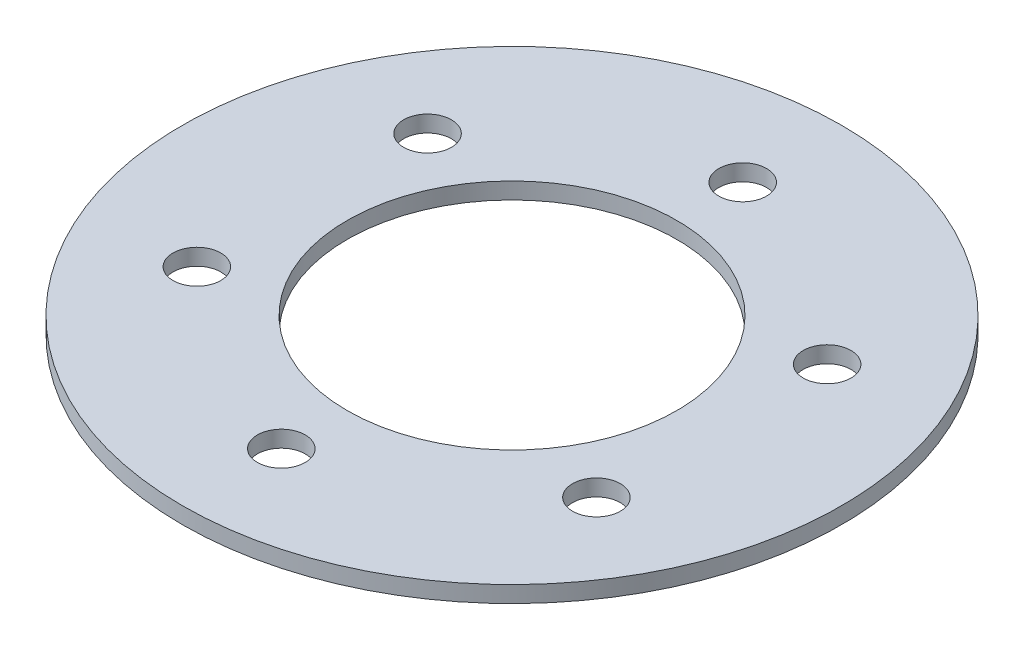
ISO-10303-21;
HEADER;
FILE_DESCRIPTION(('STEP AP214'),'2;1');
FILE_NAME('part.step','',(''),(''),'','','');
FILE_SCHEMA(('AUTOMOTIVE_DESIGN { 1 0 10303 214 1 1 1 1 }'));
ENDSEC;
DATA;
#1=APPLICATION_CONTEXT('core data for automotive mechanical design processes');
#2=APPLICATION_PROTOCOL_DEFINITION('international standard','automotive_design',2000,#1);
#3=PRODUCT_CONTEXT('',#1,'mechanical');
#4=PRODUCT('Part','Part','',(#3));
#5=PRODUCT_RELATED_PRODUCT_CATEGORY('part','',(#4));
#6=PRODUCT_DEFINITION_FORMATION('','',#4);
#7=PRODUCT_DEFINITION_CONTEXT('part definition',#1,'design');
#8=PRODUCT_DEFINITION('design','',#6,#7);
#9=PRODUCT_DEFINITION_SHAPE('','',#8);
#10=(LENGTH_UNIT() NAMED_UNIT(*) SI_UNIT(.MILLI.,.METRE.));
#11=(NAMED_UNIT(*) PLANE_ANGLE_UNIT() SI_UNIT($,.RADIAN.));
#12=(NAMED_UNIT(*) SI_UNIT($,.STERADIAN.) SOLID_ANGLE_UNIT());
#13=UNCERTAINTY_MEASURE_WITH_UNIT(LENGTH_MEASURE(1.E-05),#10,'distance_accuracy_value','');
#14=(GEOMETRIC_REPRESENTATION_CONTEXT(3) GLOBAL_UNCERTAINTY_ASSIGNED_CONTEXT((#13)) GLOBAL_UNIT_ASSIGNED_CONTEXT((#10,
#11,#12)) REPRESENTATION_CONTEXT('',''));
#15=CARTESIAN_POINT('',(0.,0.,0.));
#16=DIRECTION('',(0.,0.,1.));
#17=DIRECTION('',(1.,0.,0.));
#18=AXIS2_PLACEMENT_3D('',#15,#16,#17);
#19=CARTESIAN_POINT('',(0.,1.,0.));
#20=DIRECTION('',(0.,1.,0.));
#21=DIRECTION('',(0.,0.,1.));
#22=AXIS2_PLACEMENT_3D('',#19,#20,#21);
#23=PLANE('',#22);
#24=CARTESIAN_POINT('',(12.1243556529821,1.,-7.));
#25=DIRECTION('',(0.,1.,0.));
#26=DIRECTION('',(0.,0.,1.));
#27=AXIS2_PLACEMENT_3D('',#24,#25,#26);
#28=CIRCLE('',#27,1.45);
#29=CARTESIAN_POINT('',(12.1243556529821,1.,-5.55));
#30=VERTEX_POINT('',#29);
#31=EDGE_CURVE('E90',#30,#30,#28,.T.);
#32=ORIENTED_EDGE('',*,*,#31,.F.);
#33=EDGE_LOOP('',(#32));
#34=FACE_BOUND('',#33,.T.);
#35=CARTESIAN_POINT('',(0.,1.,14.));
#36=DIRECTION('',(0.,1.,0.));
#37=DIRECTION('',(0.,0.,1.));
#38=AXIS2_PLACEMENT_3D('',#35,#36,#37);
#39=CIRCLE('',#38,1.45);
#40=CARTESIAN_POINT('',(0.,1.,15.45));
#41=VERTEX_POINT('',#40);
#42=EDGE_CURVE('E74',#41,#41,#39,.T.);
#43=ORIENTED_EDGE('',*,*,#42,.F.);
#44=EDGE_LOOP('',(#43));
#45=FACE_BOUND('',#44,.T.);
#46=CARTESIAN_POINT('',(0.,1.,-14.));
#47=DIRECTION('',(0.,1.,0.));
#48=DIRECTION('',(0.,0.,1.));
#49=AXIS2_PLACEMENT_3D('',#46,#47,#48);
#50=CIRCLE('',#49,1.45);
#51=CARTESIAN_POINT('',(0.,1.,-12.55));
#52=VERTEX_POINT('',#51);
#53=EDGE_CURVE('E58',#52,#52,#50,.T.);
#54=ORIENTED_EDGE('',*,*,#53,.F.);
#55=EDGE_LOOP('',(#54));
#56=FACE_BOUND('',#55,.T.);
#57=CARTESIAN_POINT('',(0.,1.,0.));
#58=DIRECTION('',(0.,1.,0.));
#59=DIRECTION('',(0.,0.,1.));
#60=AXIS2_PLACEMENT_3D('',#57,#58,#59);
#61=CIRCLE('',#60,20.);
#62=CARTESIAN_POINT('',(0.,1.,20.));
#63=VERTEX_POINT('',#62);
#64=EDGE_CURVE('E10',#63,#63,#61,.T.);
#65=ORIENTED_EDGE('',*,*,#64,.T.);
#66=EDGE_LOOP('',(#65));
#67=FACE_BOUND('',#66,.T.);
#68=CARTESIAN_POINT('',(-12.1243556529821,1.,-7.));
#69=DIRECTION('',(0.,1.,0.));
#70=DIRECTION('',(0.,0.,1.));
#71=AXIS2_PLACEMENT_3D('',#68,#69,#70);
#72=CIRCLE('',#71,1.45);
#73=CARTESIAN_POINT('',(-12.1243556529821,1.,-5.55));
#74=VERTEX_POINT('',#73);
#75=EDGE_CURVE('E52',#74,#74,#72,.T.);
#76=ORIENTED_EDGE('',*,*,#75,.F.);
#77=EDGE_LOOP('',(#76));
#78=FACE_BOUND('',#77,.T.);
#79=CARTESIAN_POINT('',(-12.1243556529821,1.,7.));
#80=DIRECTION('',(0.,1.,0.));
#81=DIRECTION('',(0.,0.,1.));
#82=AXIS2_PLACEMENT_3D('',#79,#80,#81);
#83=CIRCLE('',#82,1.45);
#84=CARTESIAN_POINT('',(-12.1243556529821,1.,8.45));
#85=VERTEX_POINT('',#84);
#86=EDGE_CURVE('E66',#85,#85,#83,.T.);
#87=ORIENTED_EDGE('',*,*,#86,.F.);
#88=EDGE_LOOP('',(#87));
#89=FACE_BOUND('',#88,.T.);
#90=CARTESIAN_POINT('',(12.1243556529821,1.,7.));
#91=DIRECTION('',(0.,1.,0.));
#92=DIRECTION('',(0.,0.,1.));
#93=AXIS2_PLACEMENT_3D('',#90,#91,#92);
#94=CIRCLE('',#93,1.45);
#95=CARTESIAN_POINT('',(12.1243556529821,1.,8.45));
#96=VERTEX_POINT('',#95);
#97=EDGE_CURVE('E82',#96,#96,#94,.T.);
#98=ORIENTED_EDGE('',*,*,#97,.F.);
#99=EDGE_LOOP('',(#98));
#100=FACE_BOUND('',#99,.T.);
#101=CARTESIAN_POINT('',(0.,1.,0.));
#102=DIRECTION('',(0.,1.,0.));
#103=DIRECTION('',(0.,0.,1.));
#104=AXIS2_PLACEMENT_3D('',#101,#102,#103);
#105=CIRCLE('',#104,10.);
#106=CARTESIAN_POINT('',(0.,1.,10.));
#107=VERTEX_POINT('',#106);
#108=EDGE_CURVE('E98',#107,#107,#105,.T.);
#109=ORIENTED_EDGE('',*,*,#108,.F.);
#110=EDGE_LOOP('',(#109));
#111=FACE_BOUND('',#110,.T.);
#112=ADVANCED_FACE('F39',(#34,#45,#56,#67,#78,#89,#100,#111),#23,.T.);
#113=CARTESIAN_POINT('',(0.,0.,0.));
#114=DIRECTION('',(0.,1.,0.));
#115=DIRECTION('',(0.,0.,1.));
#116=AXIS2_PLACEMENT_3D('',#113,#114,#115);
#117=PLANE('',#116);
#118=CARTESIAN_POINT('',(0.,0.,0.));
#119=DIRECTION('',(0.,1.,0.));
#120=DIRECTION('',(0.,0.,1.));
#121=AXIS2_PLACEMENT_3D('',#118,#119,#120);
#122=CIRCLE('',#121,20.);
#123=CARTESIAN_POINT('',(0.,0.,20.));
#124=VERTEX_POINT('',#123);
#125=EDGE_CURVE('E43',#124,#124,#122,.T.);
#126=ORIENTED_EDGE('',*,*,#125,.F.);
#127=EDGE_LOOP('',(#126));
#128=FACE_BOUND('',#127,.T.);
#129=CARTESIAN_POINT('',(-12.1243556529821,0.,-7.));
#130=DIRECTION('',(0.,1.,0.));
#131=DIRECTION('',(0.,0.,1.));
#132=AXIS2_PLACEMENT_3D('',#129,#130,#131);
#133=CIRCLE('',#132,1.45);
#134=CARTESIAN_POINT('',(-12.1243556529821,0.,-5.55));
#135=VERTEX_POINT('',#134);
#136=EDGE_CURVE('E54',#135,#135,#133,.T.);
#137=ORIENTED_EDGE('',*,*,#136,.T.);
#138=EDGE_LOOP('',(#137));
#139=FACE_BOUND('',#138,.T.);
#140=CARTESIAN_POINT('',(0.,0.,-14.));
#141=DIRECTION('',(0.,1.,0.));
#142=DIRECTION('',(0.,0.,1.));
#143=AXIS2_PLACEMENT_3D('',#140,#141,#142);
#144=CIRCLE('',#143,1.45);
#145=CARTESIAN_POINT('',(0.,0.,-12.55));
#146=VERTEX_POINT('',#145);
#147=EDGE_CURVE('E62',#146,#146,#144,.T.);
#148=ORIENTED_EDGE('',*,*,#147,.T.);
#149=EDGE_LOOP('',(#148));
#150=FACE_BOUND('',#149,.T.);
#151=CARTESIAN_POINT('',(-12.1243556529821,0.,7.));
#152=DIRECTION('',(0.,1.,0.));
#153=DIRECTION('',(0.,0.,1.));
#154=AXIS2_PLACEMENT_3D('',#151,#152,#153);
#155=CIRCLE('',#154,1.45);
#156=CARTESIAN_POINT('',(-12.1243556529821,0.,8.45));
#157=VERTEX_POINT('',#156);
#158=EDGE_CURVE('E70',#157,#157,#155,.T.);
#159=ORIENTED_EDGE('',*,*,#158,.T.);
#160=EDGE_LOOP('',(#159));
#161=FACE_BOUND('',#160,.T.);
#162=CARTESIAN_POINT('',(0.,0.,14.));
#163=DIRECTION('',(0.,1.,0.));
#164=DIRECTION('',(0.,0.,1.));
#165=AXIS2_PLACEMENT_3D('',#162,#163,#164);
#166=CIRCLE('',#165,1.45);
#167=CARTESIAN_POINT('',(0.,0.,15.45));
#168=VERTEX_POINT('',#167);
#169=EDGE_CURVE('E78',#168,#168,#166,.T.);
#170=ORIENTED_EDGE('',*,*,#169,.T.);
#171=EDGE_LOOP('',(#170));
#172=FACE_BOUND('',#171,.T.);
#173=CARTESIAN_POINT('',(12.1243556529821,0.,7.));
#174=DIRECTION('',(0.,1.,0.));
#175=DIRECTION('',(0.,0.,1.));
#176=AXIS2_PLACEMENT_3D('',#173,#174,#175);
#177=CIRCLE('',#176,1.45);
#178=CARTESIAN_POINT('',(12.1243556529821,0.,8.45));
#179=VERTEX_POINT('',#178);
#180=EDGE_CURVE('E86',#179,#179,#177,.T.);
#181=ORIENTED_EDGE('',*,*,#180,.T.);
#182=EDGE_LOOP('',(#181));
#183=FACE_BOUND('',#182,.T.);
#184=CARTESIAN_POINT('',(12.1243556529821,0.,-7.));
#185=DIRECTION('',(0.,1.,0.));
#186=DIRECTION('',(0.,0.,1.));
#187=AXIS2_PLACEMENT_3D('',#184,#185,#186);
#188=CIRCLE('',#187,1.45);
#189=CARTESIAN_POINT('',(12.1243556529821,0.,-5.55));
#190=VERTEX_POINT('',#189);
#191=EDGE_CURVE('E94',#190,#190,#188,.T.);
#192=ORIENTED_EDGE('',*,*,#191,.T.);
#193=EDGE_LOOP('',(#192));
#194=FACE_BOUND('',#193,.T.);
#195=CARTESIAN_POINT('',(0.,0.,0.));
#196=DIRECTION('',(0.,1.,0.));
#197=DIRECTION('',(0.,0.,1.));
#198=AXIS2_PLACEMENT_3D('',#195,#196,#197);
#199=CIRCLE('',#198,10.);
#200=CARTESIAN_POINT('',(0.,0.,10.));
#201=VERTEX_POINT('',#200);
#202=EDGE_CURVE('E102',#201,#201,#199,.T.);
#203=ORIENTED_EDGE('',*,*,#202,.T.);
#204=EDGE_LOOP('',(#203));
#205=FACE_BOUND('',#204,.T.);
#206=ADVANCED_FACE('F114',(#128,#139,#150,#161,#172,#183,#194,#205),#117,.F.);
#207=CARTESIAN_POINT('',(0.,1.,0.));
#208=DIRECTION('',(0.,-1.,0.));
#209=DIRECTION('',(0.,0.,-1.));
#210=AXIS2_PLACEMENT_3D('',#207,#208,#209);
#211=CYLINDRICAL_SURFACE('',#210,20.);
#212=ORIENTED_EDGE('',*,*,#64,.F.);
#213=EDGE_LOOP('',(#212));
#214=FACE_BOUND('',#213,.T.);
#215=ORIENTED_EDGE('',*,*,#125,.T.);
#216=EDGE_LOOP('',(#215));
#217=FACE_BOUND('',#216,.T.);
#218=ADVANCED_FACE('F41',(#214,#217),#211,.T.);
#219=CARTESIAN_POINT('',(-12.1243556529821,1.,-7.));
#220=DIRECTION('',(0.,-1.,0.));
#221=DIRECTION('',(0.,0.,-1.));
#222=AXIS2_PLACEMENT_3D('',#219,#220,#221);
#223=CYLINDRICAL_SURFACE('',#222,1.45);
#224=ORIENTED_EDGE('',*,*,#75,.T.);
#225=EDGE_LOOP('',(#224));
#226=FACE_BOUND('',#225,.T.);
#227=ORIENTED_EDGE('',*,*,#136,.F.);
#228=EDGE_LOOP('',(#227));
#229=FACE_BOUND('',#228,.T.);
#230=ADVANCED_FACE('F124',(#226,#229),#223,.F.);
#231=CARTESIAN_POINT('',(0.,1.,-14.));
#232=DIRECTION('',(0.,-1.,0.));
#233=DIRECTION('',(0.,0.,-1.));
#234=AXIS2_PLACEMENT_3D('',#231,#232,#233);
#235=CYLINDRICAL_SURFACE('',#234,1.45);
#236=ORIENTED_EDGE('',*,*,#53,.T.);
#237=EDGE_LOOP('',(#236));
#238=FACE_BOUND('',#237,.T.);
#239=ORIENTED_EDGE('',*,*,#147,.F.);
#240=EDGE_LOOP('',(#239));
#241=FACE_BOUND('',#240,.T.);
#242=ADVANCED_FACE('F127',(#238,#241),#235,.F.);
#243=CARTESIAN_POINT('',(-12.1243556529821,1.,7.));
#244=DIRECTION('',(0.,-1.,0.));
#245=DIRECTION('',(0.,0.,-1.));
#246=AXIS2_PLACEMENT_3D('',#243,#244,#245);
#247=CYLINDRICAL_SURFACE('',#246,1.45);
#248=ORIENTED_EDGE('',*,*,#86,.T.);
#249=EDGE_LOOP('',(#248));
#250=FACE_BOUND('',#249,.T.);
#251=ORIENTED_EDGE('',*,*,#158,.F.);
#252=EDGE_LOOP('',(#251));
#253=FACE_BOUND('',#252,.T.);
#254=ADVANCED_FACE('F131',(#250,#253),#247,.F.);
#255=CARTESIAN_POINT('',(0.,1.,14.));
#256=DIRECTION('',(0.,-1.,0.));
#257=DIRECTION('',(0.,0.,-1.));
#258=AXIS2_PLACEMENT_3D('',#255,#256,#257);
#259=CYLINDRICAL_SURFACE('',#258,1.45);
#260=ORIENTED_EDGE('',*,*,#42,.T.);
#261=EDGE_LOOP('',(#260));
#262=FACE_BOUND('',#261,.T.);
#263=ORIENTED_EDGE('',*,*,#169,.F.);
#264=EDGE_LOOP('',(#263));
#265=FACE_BOUND('',#264,.T.);
#266=ADVANCED_FACE('F135',(#262,#265),#259,.F.);
#267=CARTESIAN_POINT('',(12.1243556529821,1.,7.));
#268=DIRECTION('',(0.,-1.,0.));
#269=DIRECTION('',(0.,0.,-1.));
#270=AXIS2_PLACEMENT_3D('',#267,#268,#269);
#271=CYLINDRICAL_SURFACE('',#270,1.45);
#272=ORIENTED_EDGE('',*,*,#97,.T.);
#273=EDGE_LOOP('',(#272));
#274=FACE_BOUND('',#273,.T.);
#275=ORIENTED_EDGE('',*,*,#180,.F.);
#276=EDGE_LOOP('',(#275));
#277=FACE_BOUND('',#276,.T.);
#278=ADVANCED_FACE('F139',(#274,#277),#271,.F.);
#279=CARTESIAN_POINT('',(12.1243556529821,1.,-7.));
#280=DIRECTION('',(0.,-1.,0.));
#281=DIRECTION('',(0.,0.,-1.));
#282=AXIS2_PLACEMENT_3D('',#279,#280,#281);
#283=CYLINDRICAL_SURFACE('',#282,1.45);
#284=ORIENTED_EDGE('',*,*,#31,.T.);
#285=EDGE_LOOP('',(#284));
#286=FACE_BOUND('',#285,.T.);
#287=ORIENTED_EDGE('',*,*,#191,.F.);
#288=EDGE_LOOP('',(#287));
#289=FACE_BOUND('',#288,.T.);
#290=ADVANCED_FACE('F143',(#286,#289),#283,.F.);
#291=CARTESIAN_POINT('',(0.,1.,0.));
#292=DIRECTION('',(0.,-1.,0.));
#293=DIRECTION('',(0.,0.,-1.));
#294=AXIS2_PLACEMENT_3D('',#291,#292,#293);
#295=CYLINDRICAL_SURFACE('',#294,10.);
#296=ORIENTED_EDGE('',*,*,#108,.T.);
#297=EDGE_LOOP('',(#296));
#298=FACE_BOUND('',#297,.T.);
#299=ORIENTED_EDGE('',*,*,#202,.F.);
#300=EDGE_LOOP('',(#299));
#301=FACE_BOUND('',#300,.T.);
#302=ADVANCED_FACE('F110',(#298,#301),#295,.F.);
#303=CLOSED_SHELL('',(#112,#206,#218,#230,#242,#254,#266,#278,#290,#302));
#304=MANIFOLD_SOLID_BREP('B2',#303);
#305=ADVANCED_BREP_SHAPE_REPRESENTATION('',(#18,#304),#14);
#306=SHAPE_DEFINITION_REPRESENTATION(#9,#305);
ENDSEC;
END-ISO-10303-21;
